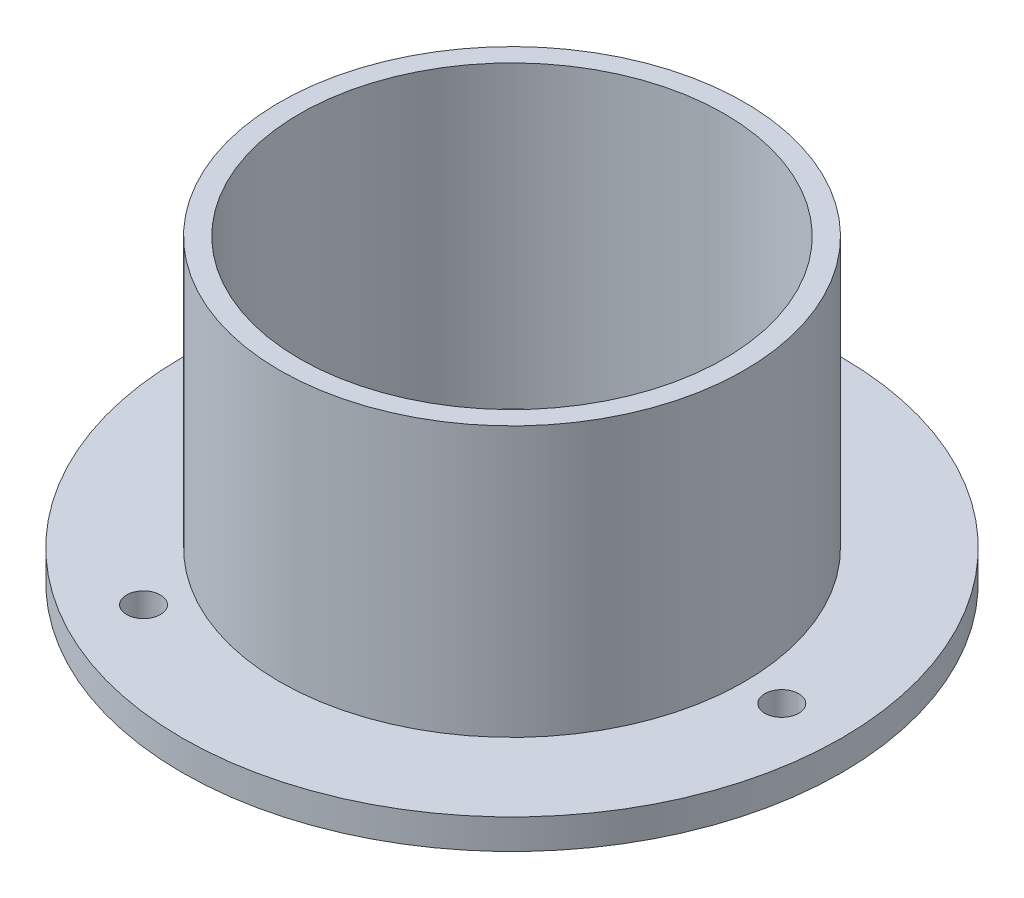
ISO-10303-21;
HEADER;
FILE_DESCRIPTION(('STEP AP214'),'2;1');
FILE_NAME('part.step','',(''),(''),'','','');
FILE_SCHEMA(('AUTOMOTIVE_DESIGN { 1 0 10303 214 1 1 1 1 }'));
ENDSEC;
DATA;
#1=APPLICATION_CONTEXT('core data for automotive mechanical design processes');
#2=APPLICATION_PROTOCOL_DEFINITION('international standard','automotive_design',2000,#1);
#3=PRODUCT_CONTEXT('',#1,'mechanical');
#4=PRODUCT('Part','Part','',(#3));
#5=PRODUCT_RELATED_PRODUCT_CATEGORY('part','',(#4));
#6=PRODUCT_DEFINITION_FORMATION('','',#4);
#7=PRODUCT_DEFINITION_CONTEXT('part definition',#1,'design');
#8=PRODUCT_DEFINITION('design','',#6,#7);
#9=PRODUCT_DEFINITION_SHAPE('','',#8);
#10=(LENGTH_UNIT() NAMED_UNIT(*) SI_UNIT(.MILLI.,.METRE.));
#11=(NAMED_UNIT(*) PLANE_ANGLE_UNIT() SI_UNIT($,.RADIAN.));
#12=(NAMED_UNIT(*) SI_UNIT($,.STERADIAN.) SOLID_ANGLE_UNIT());
#13=UNCERTAINTY_MEASURE_WITH_UNIT(LENGTH_MEASURE(1.E-05),#10,'distance_accuracy_value','');
#14=(GEOMETRIC_REPRESENTATION_CONTEXT(3) GLOBAL_UNCERTAINTY_ASSIGNED_CONTEXT((#13)) GLOBAL_UNIT_ASSIGNED_CONTEXT((#10,
#11,#12)) REPRESENTATION_CONTEXT('',''));
#15=CARTESIAN_POINT('',(0.,0.,0.));
#16=DIRECTION('',(0.,0.,1.));
#17=DIRECTION('',(1.,0.,0.));
#18=AXIS2_PLACEMENT_3D('',#15,#16,#17);
#19=CARTESIAN_POINT('',(0.,30.,0.));
#20=DIRECTION('',(0.,-1.,0.));
#21=DIRECTION('',(0.,0.,-1.));
#22=AXIS2_PLACEMENT_3D('',#19,#20,#21);
#23=CYLINDRICAL_SURFACE('',#22,21.25);
#24=CARTESIAN_POINT('',(0.,30.,0.));
#25=DIRECTION('',(0.,1.,0.));
#26=DIRECTION('',(0.,0.,1.));
#27=AXIS2_PLACEMENT_3D('',#24,#25,#26);
#28=CIRCLE('',#27,21.25);
#29=CARTESIAN_POINT('',(0.,30.,21.25));
#30=VERTEX_POINT('',#29);
#31=EDGE_CURVE('E46',#30,#30,#28,.T.);
#32=ORIENTED_EDGE('',*,*,#31,.T.);
#33=EDGE_LOOP('',(#32));
#34=FACE_BOUND('',#33,.T.);
#35=CARTESIAN_POINT('',(0.,0.,0.));
#36=DIRECTION('',(0.,1.,0.));
#37=DIRECTION('',(0.,0.,1.));
#38=AXIS2_PLACEMENT_3D('',#35,#36,#37);
#39=CIRCLE('',#38,21.25);
#40=CARTESIAN_POINT('',(0.,0.,21.25));
#41=VERTEX_POINT('',#40);
#42=EDGE_CURVE('E42',#41,#41,#39,.T.);
#43=ORIENTED_EDGE('',*,*,#42,.F.);
#44=EDGE_LOOP('',(#43));
#45=FACE_BOUND('',#44,.T.);
#46=ADVANCED_FACE('F39',(#34,#45),#23,.F.);
#47=CARTESIAN_POINT('',(0.,30.,0.));
#48=DIRECTION('',(0.,-1.,0.));
#49=DIRECTION('',(0.,0.,-1.));
#50=AXIS2_PLACEMENT_3D('',#47,#48,#49);
#51=CYLINDRICAL_SURFACE('',#50,23.25);
#52=CARTESIAN_POINT('',(0.,3.,0.));
#53=DIRECTION('',(0.,1.,0.));
#54=DIRECTION('',(0.,0.,1.));
#55=AXIS2_PLACEMENT_3D('',#52,#53,#54);
#56=CIRCLE('',#55,23.25);
#57=CARTESIAN_POINT('',(0.,3.,23.25));
#58=VERTEX_POINT('',#57);
#59=EDGE_CURVE('E55',#58,#58,#56,.T.);
#60=ORIENTED_EDGE('',*,*,#59,.T.);
#61=EDGE_LOOP('',(#60));
#62=FACE_BOUND('',#61,.T.);
#63=CARTESIAN_POINT('',(0.,30.,0.));
#64=DIRECTION('',(0.,1.,0.));
#65=DIRECTION('',(0.,0.,1.));
#66=AXIS2_PLACEMENT_3D('',#63,#64,#65);
#67=CIRCLE('',#66,23.25);
#68=CARTESIAN_POINT('',(0.,30.,23.25));
#69=VERTEX_POINT('',#68);
#70=EDGE_CURVE('E10',#69,#69,#67,.T.);
#71=ORIENTED_EDGE('',*,*,#70,.F.);
#72=EDGE_LOOP('',(#71));
#73=FACE_BOUND('',#72,.T.);
#74=ADVANCED_FACE('F115',(#62,#73),#51,.T.);
#75=CARTESIAN_POINT('',(0.,30.,0.));
#76=DIRECTION('',(0.,1.,0.));
#77=DIRECTION('',(0.,0.,1.));
#78=AXIS2_PLACEMENT_3D('',#75,#76,#77);
#79=PLANE('',#78);
#80=ORIENTED_EDGE('',*,*,#31,.F.);
#81=EDGE_LOOP('',(#80));
#82=FACE_BOUND('',#81,.T.);
#83=ORIENTED_EDGE('',*,*,#70,.T.);
#84=EDGE_LOOP('',(#83));
#85=FACE_BOUND('',#84,.T.);
#86=ADVANCED_FACE('F110',(#82,#85),#79,.T.);
#87=CARTESIAN_POINT('',(0.,0.,0.));
#88=DIRECTION('',(0.,1.,0.));
#89=DIRECTION('',(0.,0.,1.));
#90=AXIS2_PLACEMENT_3D('',#87,#88,#89);
#91=PLANE('',#90);
#92=CARTESIAN_POINT('',(27.,0.,0.));
#93=DIRECTION('',(0.,1.,0.));
#94=DIRECTION('',(0.,0.,1.));
#95=AXIS2_PLACEMENT_3D('',#92,#93,#94);
#96=CIRCLE('',#95,1.7);
#97=CARTESIAN_POINT('',(27.,0.,1.7));
#98=VERTEX_POINT('',#97);
#99=EDGE_CURVE('E56',#98,#98,#96,.T.);
#100=ORIENTED_EDGE('',*,*,#99,.T.);
#101=EDGE_LOOP('',(#100));
#102=FACE_BOUND('',#101,.T.);
#103=CARTESIAN_POINT('',(-13.5000000000001,0.,23.3826859021798));
#104=DIRECTION('',(0.,1.,0.));
#105=DIRECTION('',(0.,0.,1.));
#106=AXIS2_PLACEMENT_3D('',#103,#104,#105);
#107=CIRCLE('',#106,1.7);
#108=CARTESIAN_POINT('',(-13.5000000000001,0.,25.0826859021798));
#109=VERTEX_POINT('',#108);
#110=EDGE_CURVE('E68',#109,#109,#107,.T.);
#111=ORIENTED_EDGE('',*,*,#110,.T.);
#112=EDGE_LOOP('',(#111));
#113=FACE_BOUND('',#112,.T.);
#114=CARTESIAN_POINT('',(-13.4999999999998,0.,-23.38268590218));
#115=DIRECTION('',(0.,1.,0.));
#116=DIRECTION('',(0.,0.,1.));
#117=AXIS2_PLACEMENT_3D('',#114,#115,#116);
#118=CIRCLE('',#117,1.7);
#119=CARTESIAN_POINT('',(-13.4999999999998,0.,-21.68268590218));
#120=VERTEX_POINT('',#119);
#121=EDGE_CURVE('E62',#120,#120,#118,.T.);
#122=ORIENTED_EDGE('',*,*,#121,.T.);
#123=EDGE_LOOP('',(#122));
#124=FACE_BOUND('',#123,.T.);
#125=ORIENTED_EDGE('',*,*,#42,.T.);
#126=EDGE_LOOP('',(#125));
#127=FACE_BOUND('',#126,.T.);
#128=CARTESIAN_POINT('',(0.,0.,0.));
#129=DIRECTION('',(0.,1.,0.));
#130=DIRECTION('',(0.,0.,1.));
#131=AXIS2_PLACEMENT_3D('',#128,#129,#130);
#132=CIRCLE('',#131,33.);
#133=CARTESIAN_POINT('',(0.,0.,33.));
#134=VERTEX_POINT('',#133);
#135=EDGE_CURVE('E52',#134,#134,#132,.T.);
#136=ORIENTED_EDGE('',*,*,#135,.F.);
#137=EDGE_LOOP('',(#136));
#138=FACE_BOUND('',#137,.T.);
#139=ADVANCED_FACE('F80',(#102,#113,#124,#127,#138),#91,.F.);
#140=CARTESIAN_POINT('',(0.,3.,0.));
#141=DIRECTION('',(0.,-1.,0.));
#142=DIRECTION('',(0.,0.,-1.));
#143=AXIS2_PLACEMENT_3D('',#140,#141,#142);
#144=CYLINDRICAL_SURFACE('',#143,33.);
#145=CARTESIAN_POINT('',(0.,3.,0.));
#146=DIRECTION('',(0.,1.,0.));
#147=DIRECTION('',(0.,0.,1.));
#148=AXIS2_PLACEMENT_3D('',#145,#146,#147);
#149=CIRCLE('',#148,33.);
#150=CARTESIAN_POINT('',(0.,3.,33.));
#151=VERTEX_POINT('',#150);
#152=EDGE_CURVE('E57',#151,#151,#149,.T.);
#153=ORIENTED_EDGE('',*,*,#152,.F.);
#154=EDGE_LOOP('',(#153));
#155=FACE_BOUND('',#154,.T.);
#156=ORIENTED_EDGE('',*,*,#135,.T.);
#157=EDGE_LOOP('',(#156));
#158=FACE_BOUND('',#157,.T.);
#159=ADVANCED_FACE('F94',(#155,#158),#144,.T.);
#160=CARTESIAN_POINT('',(0.,3.,0.));
#161=DIRECTION('',(0.,1.,0.));
#162=DIRECTION('',(0.,0.,1.));
#163=AXIS2_PLACEMENT_3D('',#160,#161,#162);
#164=PLANE('',#163);
#165=CARTESIAN_POINT('',(27.,3.,0.));
#166=DIRECTION('',(0.,1.,0.));
#167=DIRECTION('',(0.,0.,1.));
#168=AXIS2_PLACEMENT_3D('',#165,#166,#167);
#169=CIRCLE('',#168,1.7);
#170=CARTESIAN_POINT('',(27.,3.,1.7));
#171=VERTEX_POINT('',#170);
#172=EDGE_CURVE('E74',#171,#171,#169,.T.);
#173=ORIENTED_EDGE('',*,*,#172,.F.);
#174=EDGE_LOOP('',(#173));
#175=FACE_BOUND('',#174,.T.);
#176=CARTESIAN_POINT('',(-13.5000000000001,3.,23.3826859021798));
#177=DIRECTION('',(0.,1.,0.));
#178=DIRECTION('',(0.,0.,1.));
#179=AXIS2_PLACEMENT_3D('',#176,#177,#178);
#180=CIRCLE('',#179,1.7);
#181=CARTESIAN_POINT('',(-13.5000000000001,3.,25.0826859021798));
#182=VERTEX_POINT('',#181);
#183=EDGE_CURVE('E71',#182,#182,#180,.T.);
#184=ORIENTED_EDGE('',*,*,#183,.F.);
#185=EDGE_LOOP('',(#184));
#186=FACE_BOUND('',#185,.T.);
#187=CARTESIAN_POINT('',(-13.4999999999998,3.,-23.38268590218));
#188=DIRECTION('',(0.,1.,0.));
#189=DIRECTION('',(0.,0.,1.));
#190=AXIS2_PLACEMENT_3D('',#187,#188,#189);
#191=CIRCLE('',#190,1.7);
#192=CARTESIAN_POINT('',(-13.4999999999998,3.,-21.68268590218));
#193=VERTEX_POINT('',#192);
#194=EDGE_CURVE('E65',#193,#193,#191,.T.);
#195=ORIENTED_EDGE('',*,*,#194,.F.);
#196=EDGE_LOOP('',(#195));
#197=FACE_BOUND('',#196,.T.);
#198=ORIENTED_EDGE('',*,*,#59,.F.);
#199=EDGE_LOOP('',(#198));
#200=FACE_BOUND('',#199,.T.);
#201=ORIENTED_EDGE('',*,*,#152,.T.);
#202=EDGE_LOOP('',(#201));
#203=FACE_BOUND('',#202,.T.);
#204=ADVANCED_FACE('F90',(#175,#186,#197,#200,#203),#164,.T.);
#205=CARTESIAN_POINT('',(-13.4999999999998,0.,-23.38268590218));
#206=DIRECTION('',(0.,1.,0.));
#207=DIRECTION('',(0.,0.,1.));
#208=AXIS2_PLACEMENT_3D('',#205,#206,#207);
#209=CYLINDRICAL_SURFACE('',#208,1.7);
#210=ORIENTED_EDGE('',*,*,#121,.F.);
#211=EDGE_LOOP('',(#210));
#212=FACE_BOUND('',#211,.T.);
#213=ORIENTED_EDGE('',*,*,#194,.T.);
#214=EDGE_LOOP('',(#213));
#215=FACE_BOUND('',#214,.T.);
#216=ADVANCED_FACE('F93',(#212,#215),#209,.F.);
#217=CARTESIAN_POINT('',(-13.5000000000001,0.,23.3826859021798));
#218=DIRECTION('',(0.,1.,0.));
#219=DIRECTION('',(0.,0.,1.));
#220=AXIS2_PLACEMENT_3D('',#217,#218,#219);
#221=CYLINDRICAL_SURFACE('',#220,1.7);
#222=ORIENTED_EDGE('',*,*,#110,.F.);
#223=EDGE_LOOP('',(#222));
#224=FACE_BOUND('',#223,.T.);
#225=ORIENTED_EDGE('',*,*,#183,.T.);
#226=EDGE_LOOP('',(#225));
#227=FACE_BOUND('',#226,.T.);
#228=ADVANCED_FACE('F86',(#224,#227),#221,.F.);
#229=CARTESIAN_POINT('',(27.,0.,0.));
#230=DIRECTION('',(0.,1.,0.));
#231=DIRECTION('',(0.,0.,1.));
#232=AXIS2_PLACEMENT_3D('',#229,#230,#231);
#233=CYLINDRICAL_SURFACE('',#232,1.7);
#234=ORIENTED_EDGE('',*,*,#99,.F.);
#235=EDGE_LOOP('',(#234));
#236=FACE_BOUND('',#235,.T.);
#237=ORIENTED_EDGE('',*,*,#172,.T.);
#238=EDGE_LOOP('',(#237));
#239=FACE_BOUND('',#238,.T.);
#240=ADVANCED_FACE('F83',(#236,#239),#233,.F.);
#241=CLOSED_SHELL('',(#46,#74,#86,#139,#159,#204,#216,#228,#240));
#242=MANIFOLD_SOLID_BREP('B2',#241);
#243=ADVANCED_BREP_SHAPE_REPRESENTATION('',(#18,#242),#14);
#244=SHAPE_DEFINITION_REPRESENTATION(#9,#243);
ENDSEC;
END-ISO-10303-21;
